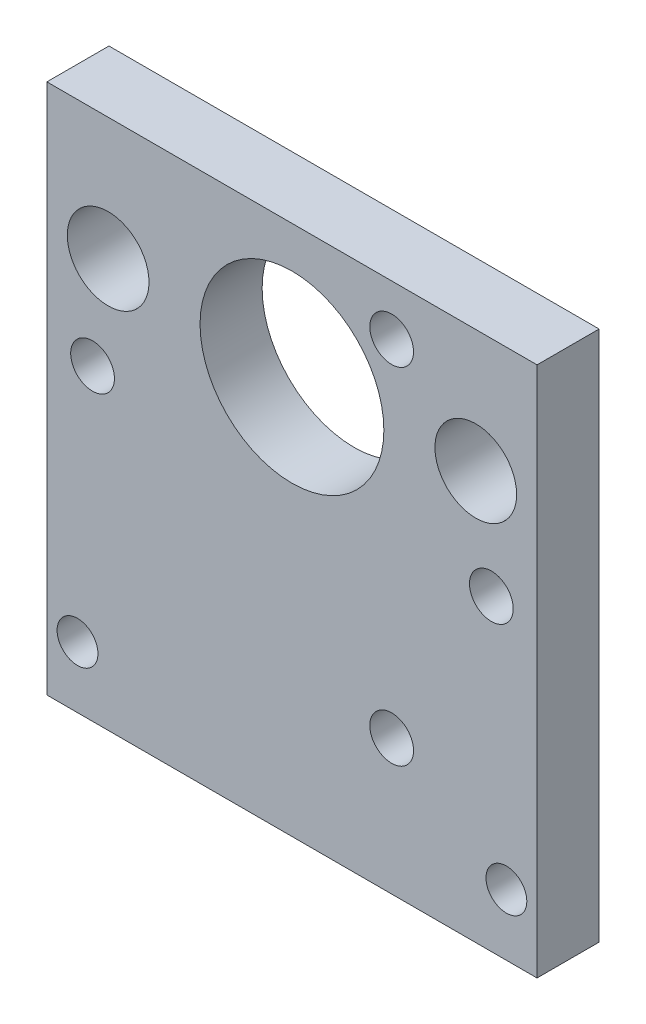
ISO-10303-21;
HEADER;
FILE_DESCRIPTION(('STEP AP214'),'2;1');
FILE_NAME('part.step','',(''),(''),'','','');
FILE_SCHEMA(('AUTOMOTIVE_DESIGN { 1 0 10303 214 1 1 1 1 }'));
ENDSEC;
DATA;
#1=APPLICATION_CONTEXT('core data for automotive mechanical design processes');
#2=APPLICATION_PROTOCOL_DEFINITION('international standard','automotive_design',2000,#1);
#3=PRODUCT_CONTEXT('',#1,'mechanical');
#4=PRODUCT('Part','Part','',(#3));
#5=PRODUCT_RELATED_PRODUCT_CATEGORY('part','',(#4));
#6=PRODUCT_DEFINITION_FORMATION('','',#4);
#7=PRODUCT_DEFINITION_CONTEXT('part definition',#1,'design');
#8=PRODUCT_DEFINITION('design','',#6,#7);
#9=PRODUCT_DEFINITION_SHAPE('','',#8);
#10=(LENGTH_UNIT() NAMED_UNIT(*) SI_UNIT(.MILLI.,.METRE.));
#11=(NAMED_UNIT(*) PLANE_ANGLE_UNIT() SI_UNIT($,.RADIAN.));
#12=(NAMED_UNIT(*) SI_UNIT($,.STERADIAN.) SOLID_ANGLE_UNIT());
#13=UNCERTAINTY_MEASURE_WITH_UNIT(LENGTH_MEASURE(1.E-05),#10,'distance_accuracy_value','');
#14=(GEOMETRIC_REPRESENTATION_CONTEXT(3) GLOBAL_UNCERTAINTY_ASSIGNED_CONTEXT((#13)) GLOBAL_UNIT_ASSIGNED_CONTEXT((#10,
#11,#12)) REPRESENTATION_CONTEXT('',''));
#15=CARTESIAN_POINT('',(0.,0.,0.));
#16=DIRECTION('',(0.,0.,1.));
#17=DIRECTION('',(1.,0.,0.));
#18=AXIS2_PLACEMENT_3D('',#15,#16,#17);
#19=CARTESIAN_POINT('',(-19.05,-20.6375,4.826));
#20=DIRECTION('',(1.,0.,0.));
#21=DIRECTION('',(0.,0.,-1.));
#22=AXIS2_PLACEMENT_3D('',#19,#20,#21);
#23=PLANE('',#22);
#24=DIRECTION('',(0.,-1.,0.));
#25=VECTOR('',#24,1.);
#26=CARTESIAN_POINT('',(-19.05,-20.6375,0.));
#27=LINE('',#26,#25);
#28=CARTESIAN_POINT('',(-19.05,20.6375,0.));
#29=VERTEX_POINT('',#28);
#30=CARTESIAN_POINT('',(-19.05,-20.6375,0.));
#31=VERTEX_POINT('',#30);
#32=EDGE_CURVE('E96',#29,#31,#27,.T.);
#33=ORIENTED_EDGE('',*,*,#32,.T.);
#34=DIRECTION('',(0.,0.,-1.));
#35=VECTOR('',#34,1.);
#36=CARTESIAN_POINT('',(-19.05,-20.6375,4.826));
#37=LINE('',#36,#35);
#38=CARTESIAN_POINT('',(-19.05,-20.6375,4.826));
#39=VERTEX_POINT('',#38);
#40=EDGE_CURVE('E11',#39,#31,#37,.T.);
#41=ORIENTED_EDGE('',*,*,#40,.F.);
#42=DIRECTION('',(0.,-1.,0.));
#43=VECTOR('',#42,1.);
#44=CARTESIAN_POINT('',(-19.05,-20.6375,4.826));
#45=LINE('',#44,#43);
#46=CARTESIAN_POINT('',(-19.05,20.6375,4.826));
#47=VERTEX_POINT('',#46);
#48=EDGE_CURVE('E84',#47,#39,#45,.T.);
#49=ORIENTED_EDGE('',*,*,#48,.F.);
#50=DIRECTION('',(0.,0.,-1.));
#51=VECTOR('',#50,1.);
#52=CARTESIAN_POINT('',(-19.05,20.6375,4.826));
#53=LINE('',#52,#51);
#54=EDGE_CURVE('E92',#47,#29,#53,.T.);
#55=ORIENTED_EDGE('',*,*,#54,.T.);
#56=EDGE_LOOP('',(#33,#41,#49,#55));
#57=FACE_BOUND('',#56,.T.);
#58=ADVANCED_FACE('F33',(#57),#23,.F.);
#59=CARTESIAN_POINT('',(19.05,-20.6375,4.826));
#60=DIRECTION('',(0.,1.,0.));
#61=DIRECTION('',(-1.,0.,0.));
#62=AXIS2_PLACEMENT_3D('',#59,#60,#61);
#63=PLANE('',#62);
#64=DIRECTION('',(1.,0.,0.));
#65=VECTOR('',#64,1.);
#66=CARTESIAN_POINT('',(19.05,-20.6375,0.));
#67=LINE('',#66,#65);
#68=CARTESIAN_POINT('',(19.05,-20.6375,0.));
#69=VERTEX_POINT('',#68);
#70=EDGE_CURVE('E88',#31,#69,#67,.T.);
#71=ORIENTED_EDGE('',*,*,#70,.T.);
#72=DIRECTION('',(0.,0.,-1.));
#73=VECTOR('',#72,1.);
#74=CARTESIAN_POINT('',(19.05,-20.6375,4.826));
#75=LINE('',#74,#73);
#76=CARTESIAN_POINT('',(19.05,-20.6375,4.826));
#77=VERTEX_POINT('',#76);
#78=EDGE_CURVE('E41',#77,#69,#75,.T.);
#79=ORIENTED_EDGE('',*,*,#78,.F.);
#80=DIRECTION('',(1.,0.,0.));
#81=VECTOR('',#80,1.);
#82=CARTESIAN_POINT('',(19.05,-20.6375,4.826));
#83=LINE('',#82,#81);
#84=EDGE_CURVE('E79',#39,#77,#83,.T.);
#85=ORIENTED_EDGE('',*,*,#84,.F.);
#86=ORIENTED_EDGE('',*,*,#40,.T.);
#87=EDGE_LOOP('',(#71,#79,#85,#86));
#88=FACE_BOUND('',#87,.T.);
#89=ADVANCED_FACE('F87',(#88),#63,.F.);
#90=CARTESIAN_POINT('',(19.05,-20.6375,4.826));
#91=DIRECTION('',(-1.,0.,0.));
#92=DIRECTION('',(0.,0.,1.));
#93=AXIS2_PLACEMENT_3D('',#90,#91,#92);
#94=PLANE('',#93);
#95=DIRECTION('',(0.,1.,0.));
#96=VECTOR('',#95,1.);
#97=CARTESIAN_POINT('',(19.05,-20.6375,0.));
#98=LINE('',#97,#96);
#99=CARTESIAN_POINT('',(19.05,20.6375,0.));
#100=VERTEX_POINT('',#99);
#101=EDGE_CURVE('E66',#69,#100,#98,.T.);
#102=ORIENTED_EDGE('',*,*,#101,.T.);
#103=DIRECTION('',(0.,0.,-1.));
#104=VECTOR('',#103,1.);
#105=CARTESIAN_POINT('',(19.05,20.6375,4.826));
#106=LINE('',#105,#104);
#107=CARTESIAN_POINT('',(19.05,20.6375,4.826));
#108=VERTEX_POINT('',#107);
#109=EDGE_CURVE('E89',#108,#100,#106,.T.);
#110=ORIENTED_EDGE('',*,*,#109,.F.);
#111=DIRECTION('',(0.,1.,0.));
#112=VECTOR('',#111,1.);
#113=CARTESIAN_POINT('',(19.05,-20.6375,4.826));
#114=LINE('',#113,#112);
#115=EDGE_CURVE('E82',#77,#108,#114,.T.);
#116=ORIENTED_EDGE('',*,*,#115,.F.);
#117=ORIENTED_EDGE('',*,*,#78,.T.);
#118=EDGE_LOOP('',(#102,#110,#116,#117));
#119=FACE_BOUND('',#118,.T.);
#120=ADVANCED_FACE('F90',(#119),#94,.F.);
#121=CARTESIAN_POINT('',(19.05,20.6375,4.826));
#122=DIRECTION('',(0.,-1.,0.));
#123=DIRECTION('',(1.,0.,0.));
#124=AXIS2_PLACEMENT_3D('',#121,#122,#123);
#125=PLANE('',#124);
#126=DIRECTION('',(-1.,0.,0.));
#127=VECTOR('',#126,1.);
#128=CARTESIAN_POINT('',(19.05,20.6375,0.));
#129=LINE('',#128,#127);
#130=EDGE_CURVE('E72',#100,#29,#129,.T.);
#131=ORIENTED_EDGE('',*,*,#130,.T.);
#132=ORIENTED_EDGE('',*,*,#54,.F.);
#133=DIRECTION('',(-1.,0.,0.));
#134=VECTOR('',#133,1.);
#135=CARTESIAN_POINT('',(19.05,20.6375,4.826));
#136=LINE('',#135,#134);
#137=EDGE_CURVE('E49',#108,#47,#136,.T.);
#138=ORIENTED_EDGE('',*,*,#137,.F.);
#139=ORIENTED_EDGE('',*,*,#109,.T.);
#140=EDGE_LOOP('',(#131,#132,#138,#139));
#141=FACE_BOUND('',#140,.T.);
#142=ADVANCED_FACE('F104',(#141),#125,.F.);
#143=CARTESIAN_POINT('',(0.,0.,4.826));
#144=DIRECTION('',(0.,0.,1.));
#145=DIRECTION('',(1.,0.,0.));
#146=AXIS2_PLACEMENT_3D('',#143,#144,#145);
#147=PLANE('',#146);
#148=CARTESIAN_POINT('',(-16.66875,-15.875,4.826));
#149=DIRECTION('',(0.,0.,1.));
#150=DIRECTION('',(1.,0.,0.));
#151=AXIS2_PLACEMENT_3D('',#148,#149,#150);
#152=CIRCLE('',#151,1.58749999999999);
#153=CARTESIAN_POINT('',(-15.08125,-15.875,4.826));
#154=VERTEX_POINT('',#153);
#155=EDGE_CURVE('E160',#154,#154,#152,.T.);
#156=ORIENTED_EDGE('',*,*,#155,.F.);
#157=EDGE_LOOP('',(#156));
#158=FACE_BOUND('',#157,.T.);
#159=CARTESIAN_POINT('',(16.66875,-15.875,4.826));
#160=DIRECTION('',(0.,0.,1.));
#161=DIRECTION('',(1.,0.,0.));
#162=AXIS2_PLACEMENT_3D('',#159,#160,#161);
#163=CIRCLE('',#162,1.58749999999999);
#164=CARTESIAN_POINT('',(18.25625,-15.875,4.826));
#165=VERTEX_POINT('',#164);
#166=EDGE_CURVE('E154',#165,#165,#163,.T.);
#167=ORIENTED_EDGE('',*,*,#166,.F.);
#168=EDGE_LOOP('',(#167));
#169=FACE_BOUND('',#168,.T.);
#170=CARTESIAN_POINT('',(-14.2875,11.1125,4.826));
#171=DIRECTION('',(0.,0.,1.));
#172=DIRECTION('',(1.,0.,0.));
#173=AXIS2_PLACEMENT_3D('',#170,#171,#172);
#174=CIRCLE('',#173,3.175);
#175=CARTESIAN_POINT('',(-11.1125,11.1125,4.826));
#176=VERTEX_POINT('',#175);
#177=EDGE_CURVE('E148',#176,#176,#174,.T.);
#178=ORIENTED_EDGE('',*,*,#177,.F.);
#179=EDGE_LOOP('',(#178));
#180=FACE_BOUND('',#179,.T.);
#181=CARTESIAN_POINT('',(14.2875,11.1125,4.826));
#182=DIRECTION('',(0.,0.,1.));
#183=DIRECTION('',(1.,0.,0.));
#184=AXIS2_PLACEMENT_3D('',#181,#182,#183);
#185=CIRCLE('',#184,3.175);
#186=CARTESIAN_POINT('',(17.4625,11.1125,4.826));
#187=VERTEX_POINT('',#186);
#188=EDGE_CURVE('E142',#187,#187,#185,.T.);
#189=ORIENTED_EDGE('',*,*,#188,.F.);
#190=EDGE_LOOP('',(#189));
#191=FACE_BOUND('',#190,.T.);
#192=CARTESIAN_POINT('',(-15.5,3.287,4.826));
#193=DIRECTION('',(0.,0.,1.));
#194=DIRECTION('',(1.,0.,0.));
#195=AXIS2_PLACEMENT_3D('',#192,#193,#194);
#196=CIRCLE('',#195,1.7);
#197=CARTESIAN_POINT('',(-13.8,3.287,4.826));
#198=VERTEX_POINT('',#197);
#199=EDGE_CURVE('E136',#198,#198,#196,.T.);
#200=ORIENTED_EDGE('',*,*,#199,.F.);
#201=EDGE_LOOP('',(#200));
#202=FACE_BOUND('',#201,.T.);
#203=CARTESIAN_POINT('',(7.75000000000002,16.7103937586588,4.826));
#204=DIRECTION('',(0.,0.,1.));
#205=DIRECTION('',(1.,0.,0.));
#206=AXIS2_PLACEMENT_3D('',#203,#204,#205);
#207=CIRCLE('',#206,1.7);
#208=CARTESIAN_POINT('',(9.45000000000001,16.7103937586588,4.826));
#209=VERTEX_POINT('',#208);
#210=EDGE_CURVE('E130',#209,#209,#207,.T.);
#211=ORIENTED_EDGE('',*,*,#210,.F.);
#212=EDGE_LOOP('',(#211));
#213=FACE_BOUND('',#212,.T.);
#214=CARTESIAN_POINT('',(15.5,3.287,4.826));
#215=DIRECTION('',(0.,0.,1.));
#216=DIRECTION('',(1.,0.,0.));
#217=AXIS2_PLACEMENT_3D('',#214,#215,#216);
#218=CIRCLE('',#217,1.7);
#219=CARTESIAN_POINT('',(17.2,3.287,4.826));
#220=VERTEX_POINT('',#219);
#221=EDGE_CURVE('E124',#220,#220,#218,.T.);
#222=ORIENTED_EDGE('',*,*,#221,.F.);
#223=EDGE_LOOP('',(#222));
#224=FACE_BOUND('',#223,.T.);
#225=CARTESIAN_POINT('',(7.75000000000002,-10.1363937586588,4.826));
#226=DIRECTION('',(0.,0.,1.));
#227=DIRECTION('',(1.,0.,0.));
#228=AXIS2_PLACEMENT_3D('',#225,#226,#227);
#229=CIRCLE('',#228,1.7);
#230=CARTESIAN_POINT('',(9.45000000000002,-10.1363937586588,4.826));
#231=VERTEX_POINT('',#230);
#232=EDGE_CURVE('E118',#231,#231,#229,.T.);
#233=ORIENTED_EDGE('',*,*,#232,.F.);
#234=EDGE_LOOP('',(#233));
#235=FACE_BOUND('',#234,.T.);
#236=CARTESIAN_POINT('',(0.,10.287,4.826));
#237=DIRECTION('',(0.,0.,1.));
#238=DIRECTION('',(1.,0.,0.));
#239=AXIS2_PLACEMENT_3D('',#236,#237,#238);
#240=CIRCLE('',#239,7.14375);
#241=CARTESIAN_POINT('',(7.14375,10.287,4.826));
#242=VERTEX_POINT('',#241);
#243=EDGE_CURVE('E110',#242,#242,#240,.T.);
#244=ORIENTED_EDGE('',*,*,#243,.F.);
#245=EDGE_LOOP('',(#244));
#246=FACE_BOUND('',#245,.T.);
#247=ORIENTED_EDGE('',*,*,#48,.T.);
#248=ORIENTED_EDGE('',*,*,#84,.T.);
#249=ORIENTED_EDGE('',*,*,#115,.T.);
#250=ORIENTED_EDGE('',*,*,#137,.T.);
#251=EDGE_LOOP('',(#247,#248,#249,#250));
#252=FACE_BOUND('',#251,.T.);
#253=ADVANCED_FACE('F80',(#158,#169,#180,#191,#202,#213,#224,#235,#246,#252),#147,.T.);
#254=CARTESIAN_POINT('',(0.,0.,0.));
#255=DIRECTION('',(0.,0.,1.));
#256=DIRECTION('',(1.,0.,0.));
#257=AXIS2_PLACEMENT_3D('',#254,#255,#256);
#258=PLANE('',#257);
#259=CARTESIAN_POINT('',(-16.66875,-15.875,0.));
#260=DIRECTION('',(0.,0.,1.));
#261=DIRECTION('',(1.,0.,0.));
#262=AXIS2_PLACEMENT_3D('',#259,#260,#261);
#263=CIRCLE('',#262,1.5875);
#264=CARTESIAN_POINT('',(-15.08125,-15.875,0.));
#265=VERTEX_POINT('',#264);
#266=EDGE_CURVE('E157',#265,#265,#263,.T.);
#267=ORIENTED_EDGE('',*,*,#266,.T.);
#268=EDGE_LOOP('',(#267));
#269=FACE_BOUND('',#268,.T.);
#270=CARTESIAN_POINT('',(16.66875,-15.875,0.));
#271=DIRECTION('',(0.,0.,1.));
#272=DIRECTION('',(1.,0.,0.));
#273=AXIS2_PLACEMENT_3D('',#270,#271,#272);
#274=CIRCLE('',#273,1.5875);
#275=CARTESIAN_POINT('',(18.25625,-15.875,0.));
#276=VERTEX_POINT('',#275);
#277=EDGE_CURVE('E151',#276,#276,#274,.T.);
#278=ORIENTED_EDGE('',*,*,#277,.T.);
#279=EDGE_LOOP('',(#278));
#280=FACE_BOUND('',#279,.T.);
#281=CARTESIAN_POINT('',(-14.2875,11.1125,0.));
#282=DIRECTION('',(0.,0.,1.));
#283=DIRECTION('',(1.,0.,0.));
#284=AXIS2_PLACEMENT_3D('',#281,#282,#283);
#285=CIRCLE('',#284,3.175);
#286=CARTESIAN_POINT('',(-11.1125,11.1125,0.));
#287=VERTEX_POINT('',#286);
#288=EDGE_CURVE('E145',#287,#287,#285,.T.);
#289=ORIENTED_EDGE('',*,*,#288,.T.);
#290=EDGE_LOOP('',(#289));
#291=FACE_BOUND('',#290,.T.);
#292=CARTESIAN_POINT('',(14.2875,11.1125,0.));
#293=DIRECTION('',(0.,0.,1.));
#294=DIRECTION('',(1.,0.,0.));
#295=AXIS2_PLACEMENT_3D('',#292,#293,#294);
#296=CIRCLE('',#295,3.175);
#297=CARTESIAN_POINT('',(17.4625,11.1125,0.));
#298=VERTEX_POINT('',#297);
#299=EDGE_CURVE('E139',#298,#298,#296,.T.);
#300=ORIENTED_EDGE('',*,*,#299,.T.);
#301=EDGE_LOOP('',(#300));
#302=FACE_BOUND('',#301,.T.);
#303=CARTESIAN_POINT('',(-15.5,3.287,0.));
#304=DIRECTION('',(0.,0.,1.));
#305=DIRECTION('',(1.,0.,0.));
#306=AXIS2_PLACEMENT_3D('',#303,#304,#305);
#307=CIRCLE('',#306,1.7);
#308=CARTESIAN_POINT('',(-13.8,3.287,0.));
#309=VERTEX_POINT('',#308);
#310=EDGE_CURVE('E133',#309,#309,#307,.T.);
#311=ORIENTED_EDGE('',*,*,#310,.T.);
#312=EDGE_LOOP('',(#311));
#313=FACE_BOUND('',#312,.T.);
#314=CARTESIAN_POINT('',(7.75000000000002,16.7103937586588,0.));
#315=DIRECTION('',(0.,0.,1.));
#316=DIRECTION('',(1.,0.,0.));
#317=AXIS2_PLACEMENT_3D('',#314,#315,#316);
#318=CIRCLE('',#317,1.7);
#319=CARTESIAN_POINT('',(9.45000000000001,16.7103937586588,0.));
#320=VERTEX_POINT('',#319);
#321=EDGE_CURVE('E127',#320,#320,#318,.T.);
#322=ORIENTED_EDGE('',*,*,#321,.T.);
#323=EDGE_LOOP('',(#322));
#324=FACE_BOUND('',#323,.T.);
#325=CARTESIAN_POINT('',(15.5,3.287,0.));
#326=DIRECTION('',(0.,0.,1.));
#327=DIRECTION('',(1.,0.,0.));
#328=AXIS2_PLACEMENT_3D('',#325,#326,#327);
#329=CIRCLE('',#328,1.7);
#330=CARTESIAN_POINT('',(17.2,3.287,0.));
#331=VERTEX_POINT('',#330);
#332=EDGE_CURVE('E121',#331,#331,#329,.T.);
#333=ORIENTED_EDGE('',*,*,#332,.T.);
#334=EDGE_LOOP('',(#333));
#335=FACE_BOUND('',#334,.T.);
#336=CARTESIAN_POINT('',(7.75000000000002,-10.1363937586588,0.));
#337=DIRECTION('',(0.,0.,1.));
#338=DIRECTION('',(1.,0.,0.));
#339=AXIS2_PLACEMENT_3D('',#336,#337,#338);
#340=CIRCLE('',#339,1.7);
#341=CARTESIAN_POINT('',(9.45000000000002,-10.1363937586588,0.));
#342=VERTEX_POINT('',#341);
#343=EDGE_CURVE('E113',#342,#342,#340,.T.);
#344=ORIENTED_EDGE('',*,*,#343,.T.);
#345=EDGE_LOOP('',(#344));
#346=FACE_BOUND('',#345,.T.);
#347=CARTESIAN_POINT('',(0.,10.287,0.));
#348=DIRECTION('',(0.,0.,1.));
#349=DIRECTION('',(1.,0.,0.));
#350=AXIS2_PLACEMENT_3D('',#347,#348,#349);
#351=CIRCLE('',#350,7.14375);
#352=CARTESIAN_POINT('',(7.14375,10.287,0.));
#353=VERTEX_POINT('',#352);
#354=EDGE_CURVE('E99',#353,#353,#351,.T.);
#355=ORIENTED_EDGE('',*,*,#354,.T.);
#356=EDGE_LOOP('',(#355));
#357=FACE_BOUND('',#356,.T.);
#358=ORIENTED_EDGE('',*,*,#32,.F.);
#359=ORIENTED_EDGE('',*,*,#130,.F.);
#360=ORIENTED_EDGE('',*,*,#101,.F.);
#361=ORIENTED_EDGE('',*,*,#70,.F.);
#362=EDGE_LOOP('',(#358,#359,#360,#361));
#363=FACE_BOUND('',#362,.T.);
#364=ADVANCED_FACE('F107',(#269,#280,#291,#302,#313,#324,#335,#346,#357,#363),#258,.F.);
#365=CARTESIAN_POINT('',(0.,10.287,0.));
#366=DIRECTION('',(0.,0.,1.));
#367=DIRECTION('',(1.,0.,0.));
#368=AXIS2_PLACEMENT_3D('',#365,#366,#367);
#369=CYLINDRICAL_SURFACE('',#368,7.14375);
#370=ORIENTED_EDGE('',*,*,#354,.F.);
#371=EDGE_LOOP('',(#370));
#372=FACE_BOUND('',#371,.T.);
#373=ORIENTED_EDGE('',*,*,#243,.T.);
#374=EDGE_LOOP('',(#373));
#375=FACE_BOUND('',#374,.T.);
#376=ADVANCED_FACE('F185',(#372,#375),#369,.F.);
#377=CARTESIAN_POINT('',(7.75000000000002,-10.1363937586588,4.826));
#378=DIRECTION('',(0.,0.,1.));
#379=DIRECTION('',(1.,0.,0.));
#380=AXIS2_PLACEMENT_3D('',#377,#378,#379);
#381=CYLINDRICAL_SURFACE('',#380,1.7);
#382=ORIENTED_EDGE('',*,*,#343,.F.);
#383=EDGE_LOOP('',(#382));
#384=FACE_BOUND('',#383,.T.);
#385=ORIENTED_EDGE('',*,*,#232,.T.);
#386=EDGE_LOOP('',(#385));
#387=FACE_BOUND('',#386,.T.);
#388=ADVANCED_FACE('F187',(#384,#387),#381,.F.);
#389=CARTESIAN_POINT('',(15.5,3.287,4.826));
#390=DIRECTION('',(0.,0.,1.));
#391=DIRECTION('',(1.,0.,0.));
#392=AXIS2_PLACEMENT_3D('',#389,#390,#391);
#393=CYLINDRICAL_SURFACE('',#392,1.7);
#394=ORIENTED_EDGE('',*,*,#332,.F.);
#395=EDGE_LOOP('',(#394));
#396=FACE_BOUND('',#395,.T.);
#397=ORIENTED_EDGE('',*,*,#221,.T.);
#398=EDGE_LOOP('',(#397));
#399=FACE_BOUND('',#398,.T.);
#400=ADVANCED_FACE('F194',(#396,#399),#393,.F.);
#401=CARTESIAN_POINT('',(7.75000000000002,16.7103937586588,4.826));
#402=DIRECTION('',(0.,0.,1.));
#403=DIRECTION('',(1.,0.,0.));
#404=AXIS2_PLACEMENT_3D('',#401,#402,#403);
#405=CYLINDRICAL_SURFACE('',#404,1.7);
#406=ORIENTED_EDGE('',*,*,#321,.F.);
#407=EDGE_LOOP('',(#406));
#408=FACE_BOUND('',#407,.T.);
#409=ORIENTED_EDGE('',*,*,#210,.T.);
#410=EDGE_LOOP('',(#409));
#411=FACE_BOUND('',#410,.T.);
#412=ADVANCED_FACE('F261',(#408,#411),#405,.F.);
#413=CARTESIAN_POINT('',(-15.5,3.287,4.826));
#414=DIRECTION('',(0.,0.,1.));
#415=DIRECTION('',(1.,0.,0.));
#416=AXIS2_PLACEMENT_3D('',#413,#414,#415);
#417=CYLINDRICAL_SURFACE('',#416,1.7);
#418=ORIENTED_EDGE('',*,*,#310,.F.);
#419=EDGE_LOOP('',(#418));
#420=FACE_BOUND('',#419,.T.);
#421=ORIENTED_EDGE('',*,*,#199,.T.);
#422=EDGE_LOOP('',(#421));
#423=FACE_BOUND('',#422,.T.);
#424=ADVANCED_FACE('F257',(#420,#423),#417,.F.);
#425=CARTESIAN_POINT('',(14.2875,11.1125,4.826));
#426=DIRECTION('',(0.,0.,1.));
#427=DIRECTION('',(1.,0.,0.));
#428=AXIS2_PLACEMENT_3D('',#425,#426,#427);
#429=CYLINDRICAL_SURFACE('',#428,3.175);
#430=ORIENTED_EDGE('',*,*,#299,.F.);
#431=EDGE_LOOP('',(#430));
#432=FACE_BOUND('',#431,.T.);
#433=ORIENTED_EDGE('',*,*,#188,.T.);
#434=EDGE_LOOP('',(#433));
#435=FACE_BOUND('',#434,.T.);
#436=ADVANCED_FACE('F253',(#432,#435),#429,.F.);
#437=CARTESIAN_POINT('',(-14.2875,11.1125,4.826));
#438=DIRECTION('',(0.,0.,1.));
#439=DIRECTION('',(1.,0.,0.));
#440=AXIS2_PLACEMENT_3D('',#437,#438,#439);
#441=CYLINDRICAL_SURFACE('',#440,3.175);
#442=ORIENTED_EDGE('',*,*,#288,.F.);
#443=EDGE_LOOP('',(#442));
#444=FACE_BOUND('',#443,.T.);
#445=ORIENTED_EDGE('',*,*,#177,.T.);
#446=EDGE_LOOP('',(#445));
#447=FACE_BOUND('',#446,.T.);
#448=ADVANCED_FACE('F234',(#444,#447),#441,.F.);
#449=CARTESIAN_POINT('',(16.66875,-15.875,4.826));
#450=DIRECTION('',(0.,0.,1.));
#451=DIRECTION('',(1.,0.,0.));
#452=AXIS2_PLACEMENT_3D('',#449,#450,#451);
#453=CYLINDRICAL_SURFACE('',#452,1.58749999999999);
#454=ORIENTED_EDGE('',*,*,#277,.F.);
#455=EDGE_LOOP('',(#454));
#456=FACE_BOUND('',#455,.T.);
#457=ORIENTED_EDGE('',*,*,#166,.T.);
#458=EDGE_LOOP('',(#457));
#459=FACE_BOUND('',#458,.T.);
#460=ADVANCED_FACE('F229',(#456,#459),#453,.F.);
#461=CARTESIAN_POINT('',(-16.66875,-15.875,4.826));
#462=DIRECTION('',(0.,0.,1.));
#463=DIRECTION('',(1.,0.,0.));
#464=AXIS2_PLACEMENT_3D('',#461,#462,#463);
#465=CYLINDRICAL_SURFACE('',#464,1.58749999999999);
#466=ORIENTED_EDGE('',*,*,#266,.F.);
#467=EDGE_LOOP('',(#466));
#468=FACE_BOUND('',#467,.T.);
#469=ORIENTED_EDGE('',*,*,#155,.T.);
#470=EDGE_LOOP('',(#469));
#471=FACE_BOUND('',#470,.T.);
#472=ADVANCED_FACE('F164',(#468,#471),#465,.F.);
#473=CLOSED_SHELL('',(#58,#89,#120,#142,#253,#364,#376,#388,#400,#412,#424,#436,#448,#460,#472));
#474=MANIFOLD_SOLID_BREP('B2',#473);
#475=ADVANCED_BREP_SHAPE_REPRESENTATION('',(#18,#474),#14);
#476=SHAPE_DEFINITION_REPRESENTATION(#9,#475);
ENDSEC;
END-ISO-10303-21;
